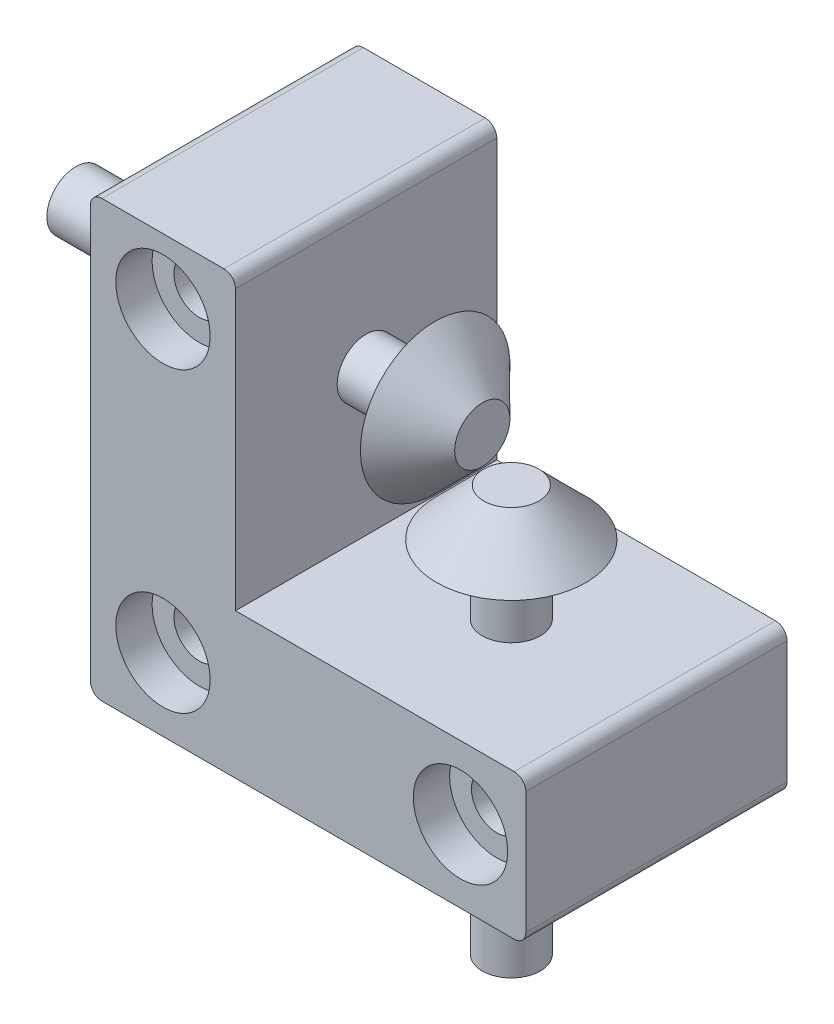
ISO-10303-21;
HEADER;
FILE_DESCRIPTION(('STEP AP214'),'2;1');
FILE_NAME('part.step','',(''),(''),'','','');
FILE_SCHEMA(('AUTOMOTIVE_DESIGN { 1 0 10303 214 1 1 1 1 }'));
ENDSEC;
DATA;
#1=APPLICATION_CONTEXT('core data for automotive mechanical design processes');
#2=APPLICATION_PROTOCOL_DEFINITION('international standard','automotive_design',2000,#1);
#3=PRODUCT_CONTEXT('',#1,'mechanical');
#4=PRODUCT('Part','Part','',(#3));
#5=PRODUCT_RELATED_PRODUCT_CATEGORY('part','',(#4));
#6=PRODUCT_DEFINITION_FORMATION('','',#4);
#7=PRODUCT_DEFINITION_CONTEXT('part definition',#1,'design');
#8=PRODUCT_DEFINITION('design','',#6,#7);
#9=PRODUCT_DEFINITION_SHAPE('','',#8);
#10=(LENGTH_UNIT() NAMED_UNIT(*) SI_UNIT(.MILLI.,.METRE.));
#11=(NAMED_UNIT(*) PLANE_ANGLE_UNIT() SI_UNIT($,.RADIAN.));
#12=(NAMED_UNIT(*) SI_UNIT($,.STERADIAN.) SOLID_ANGLE_UNIT());
#13=UNCERTAINTY_MEASURE_WITH_UNIT(LENGTH_MEASURE(1.E-05),#10,'distance_accuracy_value','');
#14=(GEOMETRIC_REPRESENTATION_CONTEXT(3) GLOBAL_UNCERTAINTY_ASSIGNED_CONTEXT((#13)) GLOBAL_UNIT_ASSIGNED_CONTEXT((#10,
#11,#12)) REPRESENTATION_CONTEXT('',''));
#15=CARTESIAN_POINT('',(0.,0.,0.));
#16=DIRECTION('',(0.,0.,1.));
#17=DIRECTION('',(1.,0.,0.));
#18=AXIS2_PLACEMENT_3D('',#15,#16,#17);
#19=CARTESIAN_POINT('',(5.,25.5,22.9497474683058));
#20=DIRECTION('',(0.,0.,-1.));
#21=DIRECTION('',(-1.,0.,0.));
#22=AXIS2_PLACEMENT_3D('',#19,#20,#21);
#23=CYLINDRICAL_SURFACE('',#22,1.75);
#24=CARTESIAN_POINT('',(5.,25.5,2.5));
#25=DIRECTION('',(0.,0.,-1.));
#26=DIRECTION('',(-1.,0.,0.));
#27=AXIS2_PLACEMENT_3D('',#24,#25,#26);
#28=CIRCLE('',#27,1.75);
#29=CARTESIAN_POINT('',(3.25,25.5,2.5));
#30=VERTEX_POINT('',#29);
#31=EDGE_CURVE('E159',#30,#30,#28,.F.);
#32=ORIENTED_EDGE('',*,*,#31,.F.);
#33=EDGE_LOOP('',(#32));
#34=FACE_BOUND('',#33,.T.);
#35=CARTESIAN_POINT('',(5.,25.5,15.5));
#36=DIRECTION('',(0.,0.,1.));
#37=DIRECTION('',(1.,0.,0.));
#38=AXIS2_PLACEMENT_3D('',#35,#36,#37);
#39=CIRCLE('',#38,1.75);
#40=CARTESIAN_POINT('',(6.75,25.5,15.5));
#41=VERTEX_POINT('',#40);
#42=EDGE_CURVE('E188',#41,#41,#39,.F.);
#43=ORIENTED_EDGE('',*,*,#42,.F.);
#44=EDGE_LOOP('',(#43));
#45=FACE_BOUND('',#44,.T.);
#46=ADVANCED_FACE('F36',(#34,#45),#23,.F.);
#47=CARTESIAN_POINT('',(5.,5.,22.9497474683058));
#48=DIRECTION('',(0.,0.,-1.));
#49=DIRECTION('',(-1.,0.,0.));
#50=AXIS2_PLACEMENT_3D('',#47,#48,#49);
#51=CYLINDRICAL_SURFACE('',#50,1.75);
#52=CARTESIAN_POINT('',(5.,5.,2.5));
#53=DIRECTION('',(0.,0.,-1.));
#54=DIRECTION('',(-1.,0.,0.));
#55=AXIS2_PLACEMENT_3D('',#52,#53,#54);
#56=CIRCLE('',#55,1.75);
#57=CARTESIAN_POINT('',(3.25,5.,2.5));
#58=VERTEX_POINT('',#57);
#59=EDGE_CURVE('E175',#58,#58,#56,.F.);
#60=ORIENTED_EDGE('',*,*,#59,.F.);
#61=EDGE_LOOP('',(#60));
#62=FACE_BOUND('',#61,.T.);
#63=CARTESIAN_POINT('',(5.,5.,15.5));
#64=DIRECTION('',(0.,0.,1.));
#65=DIRECTION('',(1.,0.,0.));
#66=AXIS2_PLACEMENT_3D('',#63,#64,#65);
#67=CIRCLE('',#66,1.75);
#68=CARTESIAN_POINT('',(6.75,5.,15.5));
#69=VERTEX_POINT('',#68);
#70=EDGE_CURVE('E184',#69,#69,#67,.F.);
#71=ORIENTED_EDGE('',*,*,#70,.F.);
#72=EDGE_LOOP('',(#71));
#73=FACE_BOUND('',#72,.T.);
#74=ADVANCED_FACE('F255',(#62,#73),#51,.F.);
#75=CARTESIAN_POINT('',(25.5,5.,22.9497474683058));
#76=DIRECTION('',(0.,0.,-1.));
#77=DIRECTION('',(-1.,0.,0.));
#78=AXIS2_PLACEMENT_3D('',#75,#76,#77);
#79=CYLINDRICAL_SURFACE('',#78,1.75);
#80=CARTESIAN_POINT('',(25.5,5.,2.5));
#81=DIRECTION('',(0.,0.,-1.));
#82=DIRECTION('',(-1.,0.,0.));
#83=AXIS2_PLACEMENT_3D('',#80,#81,#82);
#84=CIRCLE('',#83,1.75);
#85=CARTESIAN_POINT('',(23.75,5.,2.5));
#86=VERTEX_POINT('',#85);
#87=EDGE_CURVE('E172',#86,#86,#84,.F.);
#88=ORIENTED_EDGE('',*,*,#87,.F.);
#89=EDGE_LOOP('',(#88));
#90=FACE_BOUND('',#89,.T.);
#91=CARTESIAN_POINT('',(25.5,5.,15.5));
#92=DIRECTION('',(0.,0.,1.));
#93=DIRECTION('',(1.,0.,0.));
#94=AXIS2_PLACEMENT_3D('',#91,#92,#93);
#95=CIRCLE('',#94,1.75);
#96=CARTESIAN_POINT('',(27.25,5.,15.5));
#97=VERTEX_POINT('',#96);
#98=EDGE_CURVE('E181',#97,#97,#95,.F.);
#99=ORIENTED_EDGE('',*,*,#98,.F.);
#100=EDGE_LOOP('',(#99));
#101=FACE_BOUND('',#100,.T.);
#102=ADVANCED_FACE('F261',(#90,#101),#79,.F.);
#103=CARTESIAN_POINT('',(10.,30.,18.));
#104=DIRECTION('',(1.,0.,0.));
#105=DIRECTION('',(0.,1.,0.));
#106=AXIS2_PLACEMENT_3D('',#103,#104,#105);
#107=PLANE('',#106);
#108=CARTESIAN_POINT('',(10.,19.9999999999999,9.));
#109=DIRECTION('',(1.,0.,0.));
#110=DIRECTION('',(0.,1.,0.));
#111=AXIS2_PLACEMENT_3D('',#108,#109,#110);
#112=CIRCLE('',#111,2.);
#113=CARTESIAN_POINT('',(10.,21.9999999999999,9.));
#114=VERTEX_POINT('',#113);
#115=EDGE_CURVE('E11',#114,#114,#112,.T.);
#116=ORIENTED_EDGE('',*,*,#115,.F.);
#117=EDGE_LOOP('',(#116));
#118=FACE_BOUND('',#117,.T.);
#119=DIRECTION('',(0.,-1.,0.));
#120=VECTOR('',#119,1.);
#121=CARTESIAN_POINT('',(10.,30.,0.));
#122=LINE('',#121,#120);
#123=CARTESIAN_POINT('',(10.,29.2,0.));
#124=VERTEX_POINT('',#123);
#125=CARTESIAN_POINT('',(10.,10.,0.));
#126=VERTEX_POINT('',#125);
#127=EDGE_CURVE('E157',#124,#126,#122,.T.);
#128=ORIENTED_EDGE('',*,*,#127,.F.);
#129=DIRECTION('',(0.,0.,-1.));
#130=VECTOR('',#129,1.);
#131=CARTESIAN_POINT('',(10.,29.2,18.));
#132=LINE('',#131,#130);
#133=CARTESIAN_POINT('',(10.,29.2,18.));
#134=VERTEX_POINT('',#133);
#135=EDGE_CURVE('E128',#124,#134,#132,.F.);
#136=ORIENTED_EDGE('',*,*,#135,.T.);
#137=DIRECTION('',(0.,-1.,0.));
#138=VECTOR('',#137,1.);
#139=CARTESIAN_POINT('',(10.,30.,18.));
#140=LINE('',#139,#138);
#141=CARTESIAN_POINT('',(10.,10.,18.));
#142=VERTEX_POINT('',#141);
#143=EDGE_CURVE('E121',#134,#142,#140,.T.);
#144=ORIENTED_EDGE('',*,*,#143,.T.);
#145=DIRECTION('',(0.,0.,-1.));
#146=VECTOR('',#145,1.);
#147=CARTESIAN_POINT('',(10.,10.,18.));
#148=LINE('',#147,#146);
#149=EDGE_CURVE('E125',#142,#126,#148,.T.);
#150=ORIENTED_EDGE('',*,*,#149,.T.);
#151=EDGE_LOOP('',(#128,#136,#144,#150));
#152=FACE_BOUND('',#151,.T.);
#153=ADVANCED_FACE('F124',(#118,#152),#107,.T.);
#154=CARTESIAN_POINT('',(0.,30.,18.));
#155=DIRECTION('',(0.,1.,0.));
#156=DIRECTION('',(-1.,0.,0.));
#157=AXIS2_PLACEMENT_3D('',#154,#155,#156);
#158=PLANE('',#157);
#159=DIRECTION('',(1.,0.,0.));
#160=VECTOR('',#159,1.);
#161=CARTESIAN_POINT('',(0.,30.,0.));
#162=LINE('',#161,#160);
#163=CARTESIAN_POINT('',(0.8,30.,0.));
#164=VERTEX_POINT('',#163);
#165=CARTESIAN_POINT('',(9.2,30.,0.));
#166=VERTEX_POINT('',#165);
#167=EDGE_CURVE('E131',#164,#166,#162,.T.);
#168=ORIENTED_EDGE('',*,*,#167,.F.);
#169=DIRECTION('',(0.,0.,-1.));
#170=VECTOR('',#169,1.);
#171=CARTESIAN_POINT('',(0.8,30.,18.));
#172=LINE('',#171,#170);
#173=CARTESIAN_POINT('',(0.8,30.,18.));
#174=VERTEX_POINT('',#173);
#175=EDGE_CURVE('E227',#164,#174,#172,.F.);
#176=ORIENTED_EDGE('',*,*,#175,.T.);
#177=DIRECTION('',(1.,0.,0.));
#178=VECTOR('',#177,1.);
#179=CARTESIAN_POINT('',(0.,30.,18.));
#180=LINE('',#179,#178);
#181=CARTESIAN_POINT('',(9.2,30.,18.));
#182=VERTEX_POINT('',#181);
#183=EDGE_CURVE('E140',#174,#182,#180,.T.);
#184=ORIENTED_EDGE('',*,*,#183,.T.);
#185=DIRECTION('',(0.,0.,-1.));
#186=VECTOR('',#185,1.);
#187=CARTESIAN_POINT('',(9.2,30.,18.));
#188=LINE('',#187,#186);
#189=EDGE_CURVE('E224',#182,#166,#188,.T.);
#190=ORIENTED_EDGE('',*,*,#189,.T.);
#191=EDGE_LOOP('',(#168,#176,#184,#190));
#192=FACE_BOUND('',#191,.T.);
#193=ADVANCED_FACE('F272',(#192),#158,.T.);
#194=CARTESIAN_POINT('',(0.,0.,18.));
#195=DIRECTION('',(-1.,0.,0.));
#196=DIRECTION('',(0.,0.,1.));
#197=AXIS2_PLACEMENT_3D('',#194,#195,#196);
#198=PLANE('',#197);
#199=CARTESIAN_POINT('',(0.,20.,9.));
#200=DIRECTION('',(-1.,0.,0.));
#201=DIRECTION('',(0.,0.,1.));
#202=AXIS2_PLACEMENT_3D('',#199,#200,#201);
#203=CIRCLE('',#202,2.);
#204=CARTESIAN_POINT('',(0.,20.,11.));
#205=VERTEX_POINT('',#204);
#206=EDGE_CURVE('E232',#205,#205,#203,.T.);
#207=ORIENTED_EDGE('',*,*,#206,.F.);
#208=EDGE_LOOP('',(#207));
#209=FACE_BOUND('',#208,.T.);
#210=DIRECTION('',(0.,1.,0.));
#211=VECTOR('',#210,1.);
#212=CARTESIAN_POINT('',(0.,0.,0.));
#213=LINE('',#212,#211);
#214=CARTESIAN_POINT('',(0.,0.8,0.));
#215=VERTEX_POINT('',#214);
#216=CARTESIAN_POINT('',(0.,29.2,0.));
#217=VERTEX_POINT('',#216);
#218=EDGE_CURVE('E167',#215,#217,#213,.T.);
#219=ORIENTED_EDGE('',*,*,#218,.F.);
#220=DIRECTION('',(0.,0.,-1.));
#221=VECTOR('',#220,1.);
#222=CARTESIAN_POINT('',(0.,0.8,18.));
#223=LINE('',#222,#221);
#224=CARTESIAN_POINT('',(0.,0.8,18.));
#225=VERTEX_POINT('',#224);
#226=EDGE_CURVE('E209',#215,#225,#223,.F.);
#227=ORIENTED_EDGE('',*,*,#226,.T.);
#228=DIRECTION('',(0.,1.,0.));
#229=VECTOR('',#228,1.);
#230=CARTESIAN_POINT('',(0.,0.,18.));
#231=LINE('',#230,#229);
#232=CARTESIAN_POINT('',(0.,29.2,18.));
#233=VERTEX_POINT('',#232);
#234=EDGE_CURVE('E152',#225,#233,#231,.T.);
#235=ORIENTED_EDGE('',*,*,#234,.T.);
#236=DIRECTION('',(0.,0.,-1.));
#237=VECTOR('',#236,1.);
#238=CARTESIAN_POINT('',(0.,29.2,18.));
#239=LINE('',#238,#237);
#240=EDGE_CURVE('E206',#233,#217,#239,.T.);
#241=ORIENTED_EDGE('',*,*,#240,.T.);
#242=EDGE_LOOP('',(#219,#227,#235,#241));
#243=FACE_BOUND('',#242,.T.);
#244=ADVANCED_FACE('F275',(#209,#243),#198,.T.);
#245=CARTESIAN_POINT('',(30.,0.,18.));
#246=DIRECTION('',(0.,-1.,0.));
#247=DIRECTION('',(0.,0.,-1.));
#248=AXIS2_PLACEMENT_3D('',#245,#246,#247);
#249=PLANE('',#248);
#250=CARTESIAN_POINT('',(20.,0.,9.));
#251=DIRECTION('',(0.,-1.,0.));
#252=DIRECTION('',(0.,0.,-1.));
#253=AXIS2_PLACEMENT_3D('',#250,#251,#252);
#254=CIRCLE('',#253,2.);
#255=CARTESIAN_POINT('',(20.,0.,7.));
#256=VERTEX_POINT('',#255);
#257=EDGE_CURVE('E287',#256,#256,#254,.T.);
#258=ORIENTED_EDGE('',*,*,#257,.F.);
#259=EDGE_LOOP('',(#258));
#260=FACE_BOUND('',#259,.T.);
#261=DIRECTION('',(-1.,0.,0.));
#262=VECTOR('',#261,1.);
#263=CARTESIAN_POINT('',(30.,0.,18.));
#264=LINE('',#263,#262);
#265=CARTESIAN_POINT('',(29.2,0.,18.));
#266=VERTEX_POINT('',#265);
#267=CARTESIAN_POINT('',(0.799999999999999,0.,18.));
#268=VERTEX_POINT('',#267);
#269=EDGE_CURVE('E146',#266,#268,#264,.T.);
#270=ORIENTED_EDGE('',*,*,#269,.T.);
#271=DIRECTION('',(0.,0.,-1.));
#272=VECTOR('',#271,1.);
#273=CARTESIAN_POINT('',(0.799999999999999,0.,18.));
#274=LINE('',#273,#272);
#275=CARTESIAN_POINT('',(0.799999999999999,0.,0.));
#276=VERTEX_POINT('',#275);
#277=EDGE_CURVE('E193',#268,#276,#274,.T.);
#278=ORIENTED_EDGE('',*,*,#277,.T.);
#279=DIRECTION('',(-1.,0.,0.));
#280=VECTOR('',#279,1.);
#281=CARTESIAN_POINT('',(30.,0.,0.));
#282=LINE('',#281,#280);
#283=CARTESIAN_POINT('',(29.2,0.,0.));
#284=VERTEX_POINT('',#283);
#285=EDGE_CURVE('E164',#284,#276,#282,.T.);
#286=ORIENTED_EDGE('',*,*,#285,.F.);
#287=DIRECTION('',(0.,0.,-1.));
#288=VECTOR('',#287,1.);
#289=CARTESIAN_POINT('',(29.2,0.,18.));
#290=LINE('',#289,#288);
#291=EDGE_CURVE('E139',#284,#266,#290,.F.);
#292=ORIENTED_EDGE('',*,*,#291,.T.);
#293=EDGE_LOOP('',(#270,#278,#286,#292));
#294=FACE_BOUND('',#293,.T.);
#295=ADVANCED_FACE('F250',(#260,#294),#249,.T.);
#296=CARTESIAN_POINT('',(30.,10.,18.));
#297=DIRECTION('',(1.,0.,0.));
#298=DIRECTION('',(0.,0.,-1.));
#299=AXIS2_PLACEMENT_3D('',#296,#297,#298);
#300=PLANE('',#299);
#301=DIRECTION('',(0.,-1.,0.));
#302=VECTOR('',#301,1.);
#303=CARTESIAN_POINT('',(30.,10.,18.));
#304=LINE('',#303,#302);
#305=CARTESIAN_POINT('',(30.,9.2,18.));
#306=VERTEX_POINT('',#305);
#307=CARTESIAN_POINT('',(30.,0.8,18.));
#308=VERTEX_POINT('',#307);
#309=EDGE_CURVE('E144',#306,#308,#304,.T.);
#310=ORIENTED_EDGE('',*,*,#309,.T.);
#311=DIRECTION('',(0.,0.,-1.));
#312=VECTOR('',#311,1.);
#313=CARTESIAN_POINT('',(30.,0.8,18.));
#314=LINE('',#313,#312);
#315=CARTESIAN_POINT('',(30.,0.8,0.));
#316=VERTEX_POINT('',#315);
#317=EDGE_CURVE('E221',#308,#316,#314,.T.);
#318=ORIENTED_EDGE('',*,*,#317,.T.);
#319=DIRECTION('',(0.,-1.,0.));
#320=VECTOR('',#319,1.);
#321=CARTESIAN_POINT('',(30.,10.,0.));
#322=LINE('',#321,#320);
#323=CARTESIAN_POINT('',(30.,9.2,0.));
#324=VERTEX_POINT('',#323);
#325=EDGE_CURVE('E161',#324,#316,#322,.T.);
#326=ORIENTED_EDGE('',*,*,#325,.F.);
#327=DIRECTION('',(0.,0.,-1.));
#328=VECTOR('',#327,1.);
#329=CARTESIAN_POINT('',(30.,9.2,18.));
#330=LINE('',#329,#328);
#331=EDGE_CURVE('E219',#324,#306,#330,.F.);
#332=ORIENTED_EDGE('',*,*,#331,.T.);
#333=EDGE_LOOP('',(#310,#318,#326,#332));
#334=FACE_BOUND('',#333,.T.);
#335=ADVANCED_FACE('F241',(#334),#300,.T.);
#336=CARTESIAN_POINT('',(10.,10.,18.));
#337=DIRECTION('',(0.,1.,0.));
#338=DIRECTION('',(0.,0.,1.));
#339=AXIS2_PLACEMENT_3D('',#336,#337,#338);
#340=PLANE('',#339);
#341=CARTESIAN_POINT('',(20.,10.,9.));
#342=DIRECTION('',(0.,1.,0.));
#343=DIRECTION('',(0.,0.,1.));
#344=AXIS2_PLACEMENT_3D('',#341,#342,#343);
#345=CIRCLE('',#344,2.);
#346=CARTESIAN_POINT('',(20.,10.,11.));
#347=VERTEX_POINT('',#346);
#348=EDGE_CURVE('E44',#347,#347,#345,.T.);
#349=ORIENTED_EDGE('',*,*,#348,.F.);
#350=EDGE_LOOP('',(#349));
#351=FACE_BOUND('',#350,.T.);
#352=DIRECTION('',(1.,0.,0.));
#353=VECTOR('',#352,1.);
#354=CARTESIAN_POINT('',(10.,10.,18.));
#355=LINE('',#354,#353);
#356=CARTESIAN_POINT('',(29.2,10.,18.));
#357=VERTEX_POINT('',#356);
#358=EDGE_CURVE('E130',#142,#357,#355,.T.);
#359=ORIENTED_EDGE('',*,*,#358,.T.);
#360=DIRECTION('',(0.,0.,-1.));
#361=VECTOR('',#360,1.);
#362=CARTESIAN_POINT('',(29.2,10.,18.));
#363=LINE('',#362,#361);
#364=CARTESIAN_POINT('',(29.2,10.,0.));
#365=VERTEX_POINT('',#364);
#366=EDGE_CURVE('E230',#357,#365,#363,.T.);
#367=ORIENTED_EDGE('',*,*,#366,.T.);
#368=DIRECTION('',(1.,0.,0.));
#369=VECTOR('',#368,1.);
#370=CARTESIAN_POINT('',(10.,10.,0.));
#371=LINE('',#370,#369);
#372=EDGE_CURVE('E138',#126,#365,#371,.T.);
#373=ORIENTED_EDGE('',*,*,#372,.F.);
#374=ORIENTED_EDGE('',*,*,#149,.F.);
#375=EDGE_LOOP('',(#359,#367,#373,#374));
#376=FACE_BOUND('',#375,.T.);
#377=ADVANCED_FACE('F134',(#351,#376),#340,.T.);
#378=CARTESIAN_POINT('',(0.,0.,18.));
#379=DIRECTION('',(0.,0.,1.));
#380=DIRECTION('',(1.,0.,0.));
#381=AXIS2_PLACEMENT_3D('',#378,#379,#380);
#382=PLANE('',#381);
#383=CARTESIAN_POINT('',(25.5,5.,18.));
#384=DIRECTION('',(0.,0.,-1.));
#385=DIRECTION('',(-1.,0.,0.));
#386=AXIS2_PLACEMENT_3D('',#383,#384,#385);
#387=CIRCLE('',#386,3.25);
#388=CARTESIAN_POINT('',(22.25,5.,18.));
#389=VERTEX_POINT('',#388);
#390=EDGE_CURVE('E376',#389,#389,#387,.T.);
#391=ORIENTED_EDGE('',*,*,#390,.T.);
#392=EDGE_LOOP('',(#391));
#393=FACE_BOUND('',#392,.T.);
#394=CARTESIAN_POINT('',(5.,5.,18.));
#395=DIRECTION('',(0.,0.,-1.));
#396=DIRECTION('',(-1.,0.,0.));
#397=AXIS2_PLACEMENT_3D('',#394,#395,#396);
#398=CIRCLE('',#397,3.25);
#399=CARTESIAN_POINT('',(1.75,5.,18.));
#400=VERTEX_POINT('',#399);
#401=EDGE_CURVE('E382',#400,#400,#398,.T.);
#402=ORIENTED_EDGE('',*,*,#401,.T.);
#403=EDGE_LOOP('',(#402));
#404=FACE_BOUND('',#403,.T.);
#405=CARTESIAN_POINT('',(5.,25.5,18.));
#406=DIRECTION('',(0.,0.,-1.));
#407=DIRECTION('',(-1.,0.,0.));
#408=AXIS2_PLACEMENT_3D('',#405,#406,#407);
#409=CIRCLE('',#408,3.25);
#410=CARTESIAN_POINT('',(1.75,25.5,18.));
#411=VERTEX_POINT('',#410);
#412=EDGE_CURVE('E372',#411,#411,#409,.T.);
#413=ORIENTED_EDGE('',*,*,#412,.T.);
#414=EDGE_LOOP('',(#413));
#415=FACE_BOUND('',#414,.T.);
#416=ORIENTED_EDGE('',*,*,#234,.F.);
#417=CARTESIAN_POINT('',(0.799999999999999,0.8,18.));
#418=DIRECTION('',(0.,0.,1.));
#419=DIRECTION('',(1.,0.,0.));
#420=AXIS2_PLACEMENT_3D('',#417,#418,#419);
#421=CIRCLE('',#420,0.8);
#422=EDGE_CURVE('E217',#225,#268,#421,.T.);
#423=ORIENTED_EDGE('',*,*,#422,.T.);
#424=ORIENTED_EDGE('',*,*,#269,.F.);
#425=CARTESIAN_POINT('',(29.2,0.8,18.));
#426=DIRECTION('',(0.,0.,1.));
#427=DIRECTION('',(1.,0.,0.));
#428=AXIS2_PLACEMENT_3D('',#425,#426,#427);
#429=CIRCLE('',#428,0.8);
#430=EDGE_CURVE('E57',#266,#308,#429,.T.);
#431=ORIENTED_EDGE('',*,*,#430,.T.);
#432=ORIENTED_EDGE('',*,*,#309,.F.);
#433=CARTESIAN_POINT('',(29.2,9.2,18.));
#434=DIRECTION('',(0.,0.,1.));
#435=DIRECTION('',(1.,0.,0.));
#436=AXIS2_PLACEMENT_3D('',#433,#434,#435);
#437=CIRCLE('',#436,0.8);
#438=EDGE_CURVE('E51',#306,#357,#437,.T.);
#439=ORIENTED_EDGE('',*,*,#438,.T.);
#440=ORIENTED_EDGE('',*,*,#358,.F.);
#441=ORIENTED_EDGE('',*,*,#143,.F.);
#442=CARTESIAN_POINT('',(9.2,29.2,18.));
#443=DIRECTION('',(0.,0.,1.));
#444=DIRECTION('',(1.,0.,0.));
#445=AXIS2_PLACEMENT_3D('',#442,#443,#444);
#446=CIRCLE('',#445,0.8);
#447=EDGE_CURVE('E212',#134,#182,#446,.T.);
#448=ORIENTED_EDGE('',*,*,#447,.T.);
#449=ORIENTED_EDGE('',*,*,#183,.F.);
#450=CARTESIAN_POINT('',(0.8,29.2,18.));
#451=DIRECTION('',(0.,0.,1.));
#452=DIRECTION('',(1.,0.,0.));
#453=AXIS2_PLACEMENT_3D('',#450,#451,#452);
#454=CIRCLE('',#453,0.8);
#455=EDGE_CURVE('E214',#174,#233,#454,.T.);
#456=ORIENTED_EDGE('',*,*,#455,.T.);
#457=EDGE_LOOP('',(#416,#423,#424,#431,#432,#439,#440,#441,#448,#449,#456));
#458=FACE_BOUND('',#457,.T.);
#459=ADVANCED_FACE('F143',(#393,#404,#415,#458),#382,.T.);
#460=CARTESIAN_POINT('',(0.,0.,0.));
#461=DIRECTION('',(0.,0.,1.));
#462=DIRECTION('',(1.,0.,0.));
#463=AXIS2_PLACEMENT_3D('',#460,#461,#462);
#464=PLANE('',#463);
#465=CARTESIAN_POINT('',(25.5,5.,0.));
#466=DIRECTION('',(0.,0.,-1.));
#467=DIRECTION('',(-1.,0.,0.));
#468=AXIS2_PLACEMENT_3D('',#465,#466,#467);
#469=CIRCLE('',#468,3.25);
#470=CARTESIAN_POINT('',(22.25,5.,0.));
#471=VERTEX_POINT('',#470);
#472=EDGE_CURVE('E392',#471,#471,#469,.T.);
#473=ORIENTED_EDGE('',*,*,#472,.F.);
#474=EDGE_LOOP('',(#473));
#475=FACE_BOUND('',#474,.T.);
#476=CARTESIAN_POINT('',(5.,5.,0.));
#477=DIRECTION('',(0.,0.,-1.));
#478=DIRECTION('',(-1.,0.,0.));
#479=AXIS2_PLACEMENT_3D('',#476,#477,#478);
#480=CIRCLE('',#479,3.25);
#481=CARTESIAN_POINT('',(1.75,5.,0.));
#482=VERTEX_POINT('',#481);
#483=EDGE_CURVE('E398',#482,#482,#480,.T.);
#484=ORIENTED_EDGE('',*,*,#483,.F.);
#485=EDGE_LOOP('',(#484));
#486=FACE_BOUND('',#485,.T.);
#487=CARTESIAN_POINT('',(5.,25.5,0.));
#488=DIRECTION('',(0.,0.,-1.));
#489=DIRECTION('',(-1.,0.,0.));
#490=AXIS2_PLACEMENT_3D('',#487,#488,#489);
#491=CIRCLE('',#490,3.25);
#492=CARTESIAN_POINT('',(1.75,25.5,0.));
#493=VERTEX_POINT('',#492);
#494=EDGE_CURVE('E191',#493,#493,#491,.T.);
#495=ORIENTED_EDGE('',*,*,#494,.F.);
#496=EDGE_LOOP('',(#495));
#497=FACE_BOUND('',#496,.T.);
#498=ORIENTED_EDGE('',*,*,#285,.T.);
#499=CARTESIAN_POINT('',(0.799999999999999,0.8,0.));
#500=DIRECTION('',(0.,0.,1.));
#501=DIRECTION('',(1.,0.,0.));
#502=AXIS2_PLACEMENT_3D('',#499,#500,#501);
#503=CIRCLE('',#502,0.8);
#504=EDGE_CURVE('E204',#276,#215,#503,.F.);
#505=ORIENTED_EDGE('',*,*,#504,.T.);
#506=ORIENTED_EDGE('',*,*,#218,.T.);
#507=CARTESIAN_POINT('',(0.8,29.2,0.));
#508=DIRECTION('',(0.,0.,1.));
#509=DIRECTION('',(1.,0.,0.));
#510=AXIS2_PLACEMENT_3D('',#507,#508,#509);
#511=CIRCLE('',#510,0.8);
#512=EDGE_CURVE('E200',#217,#164,#511,.F.);
#513=ORIENTED_EDGE('',*,*,#512,.T.);
#514=ORIENTED_EDGE('',*,*,#167,.T.);
#515=CARTESIAN_POINT('',(9.2,29.2,0.));
#516=DIRECTION('',(0.,0.,1.));
#517=DIRECTION('',(1.,0.,0.));
#518=AXIS2_PLACEMENT_3D('',#515,#516,#517);
#519=CIRCLE('',#518,0.8);
#520=EDGE_CURVE('E198',#166,#124,#519,.F.);
#521=ORIENTED_EDGE('',*,*,#520,.T.);
#522=ORIENTED_EDGE('',*,*,#127,.T.);
#523=ORIENTED_EDGE('',*,*,#372,.T.);
#524=CARTESIAN_POINT('',(29.2,9.2,0.));
#525=DIRECTION('',(0.,0.,1.));
#526=DIRECTION('',(1.,0.,0.));
#527=AXIS2_PLACEMENT_3D('',#524,#525,#526);
#528=CIRCLE('',#527,0.8);
#529=EDGE_CURVE('E196',#365,#324,#528,.F.);
#530=ORIENTED_EDGE('',*,*,#529,.T.);
#531=ORIENTED_EDGE('',*,*,#325,.T.);
#532=CARTESIAN_POINT('',(29.2,0.8,0.));
#533=DIRECTION('',(0.,0.,1.));
#534=DIRECTION('',(1.,0.,0.));
#535=AXIS2_PLACEMENT_3D('',#532,#533,#534);
#536=CIRCLE('',#535,0.8);
#537=EDGE_CURVE('E202',#316,#284,#536,.F.);
#538=ORIENTED_EDGE('',*,*,#537,.T.);
#539=EDGE_LOOP('',(#498,#505,#506,#513,#514,#521,#522,#523,#530,#531,#538));
#540=FACE_BOUND('',#539,.T.);
#541=ADVANCED_FACE('F247',(#475,#486,#497,#540),#464,.F.);
#542=CARTESIAN_POINT('',(25.5,5.,2.5));
#543=DIRECTION('',(0.,0.,-1.));
#544=DIRECTION('',(-1.,0.,0.));
#545=AXIS2_PLACEMENT_3D('',#542,#543,#544);
#546=PLANE('',#545);
#547=CARTESIAN_POINT('',(25.5,5.,2.5));
#548=DIRECTION('',(0.,0.,-1.));
#549=DIRECTION('',(-1.,0.,0.));
#550=AXIS2_PLACEMENT_3D('',#547,#548,#549);
#551=CIRCLE('',#550,3.25);
#552=CARTESIAN_POINT('',(22.25,5.,2.5));
#553=VERTEX_POINT('',#552);
#554=EDGE_CURVE('E176',#553,#553,#551,.T.);
#555=ORIENTED_EDGE('',*,*,#554,.T.);
#556=EDGE_LOOP('',(#555));
#557=FACE_BOUND('',#556,.T.);
#558=ORIENTED_EDGE('',*,*,#87,.T.);
#559=EDGE_LOOP('',(#558));
#560=FACE_BOUND('',#559,.T.);
#561=ADVANCED_FACE('F270',(#557,#560),#546,.T.);
#562=CARTESIAN_POINT('',(25.5,5.,2.5));
#563=DIRECTION('',(0.,0.,-1.));
#564=DIRECTION('',(-1.,0.,0.));
#565=AXIS2_PLACEMENT_3D('',#562,#563,#564);
#566=CYLINDRICAL_SURFACE('',#565,3.25);
#567=ORIENTED_EDGE('',*,*,#554,.F.);
#568=EDGE_LOOP('',(#567));
#569=FACE_BOUND('',#568,.T.);
#570=ORIENTED_EDGE('',*,*,#472,.T.);
#571=EDGE_LOOP('',(#570));
#572=FACE_BOUND('',#571,.T.);
#573=ADVANCED_FACE('F431',(#569,#572),#566,.F.);
#574=CARTESIAN_POINT('',(5.,5.,2.5));
#575=DIRECTION('',(0.,0.,-1.));
#576=DIRECTION('',(-1.,0.,0.));
#577=AXIS2_PLACEMENT_3D('',#574,#575,#576);
#578=PLANE('',#577);
#579=CARTESIAN_POINT('',(5.,5.,2.5));
#580=DIRECTION('',(0.,0.,-1.));
#581=DIRECTION('',(-1.,0.,0.));
#582=AXIS2_PLACEMENT_3D('',#579,#580,#581);
#583=CIRCLE('',#582,3.25);
#584=CARTESIAN_POINT('',(1.75,5.,2.5));
#585=VERTEX_POINT('',#584);
#586=EDGE_CURVE('E395',#585,#585,#583,.T.);
#587=ORIENTED_EDGE('',*,*,#586,.T.);
#588=EDGE_LOOP('',(#587));
#589=FACE_BOUND('',#588,.T.);
#590=ORIENTED_EDGE('',*,*,#59,.T.);
#591=EDGE_LOOP('',(#590));
#592=FACE_BOUND('',#591,.T.);
#593=ADVANCED_FACE('F427',(#589,#592),#578,.T.);
#594=CARTESIAN_POINT('',(5.,5.,2.5));
#595=DIRECTION('',(0.,0.,-1.));
#596=DIRECTION('',(-1.,0.,0.));
#597=AXIS2_PLACEMENT_3D('',#594,#595,#596);
#598=CYLINDRICAL_SURFACE('',#597,3.25);
#599=ORIENTED_EDGE('',*,*,#586,.F.);
#600=EDGE_LOOP('',(#599));
#601=FACE_BOUND('',#600,.T.);
#602=ORIENTED_EDGE('',*,*,#483,.T.);
#603=EDGE_LOOP('',(#602));
#604=FACE_BOUND('',#603,.T.);
#605=ADVANCED_FACE('F420',(#601,#604),#598,.F.);
#606=CARTESIAN_POINT('',(5.,25.5,2.5));
#607=DIRECTION('',(0.,0.,-1.));
#608=DIRECTION('',(-1.,0.,0.));
#609=AXIS2_PLACEMENT_3D('',#606,#607,#608);
#610=PLANE('',#609);
#611=CARTESIAN_POINT('',(5.,25.5,2.5));
#612=DIRECTION('',(0.,0.,-1.));
#613=DIRECTION('',(-1.,0.,0.));
#614=AXIS2_PLACEMENT_3D('',#611,#612,#613);
#615=CIRCLE('',#614,3.25);
#616=CARTESIAN_POINT('',(1.75,25.5,2.5));
#617=VERTEX_POINT('',#616);
#618=EDGE_CURVE('E401',#617,#617,#615,.T.);
#619=ORIENTED_EDGE('',*,*,#618,.T.);
#620=EDGE_LOOP('',(#619));
#621=FACE_BOUND('',#620,.T.);
#622=ORIENTED_EDGE('',*,*,#31,.T.);
#623=EDGE_LOOP('',(#622));
#624=FACE_BOUND('',#623,.T.);
#625=ADVANCED_FACE('F410',(#621,#624),#610,.T.);
#626=CARTESIAN_POINT('',(5.,25.5,2.5));
#627=DIRECTION('',(0.,0.,-1.));
#628=DIRECTION('',(-1.,0.,0.));
#629=AXIS2_PLACEMENT_3D('',#626,#627,#628);
#630=CYLINDRICAL_SURFACE('',#629,3.25);
#631=ORIENTED_EDGE('',*,*,#618,.F.);
#632=EDGE_LOOP('',(#631));
#633=FACE_BOUND('',#632,.T.);
#634=ORIENTED_EDGE('',*,*,#494,.T.);
#635=EDGE_LOOP('',(#634));
#636=FACE_BOUND('',#635,.T.);
#637=ADVANCED_FACE('F406',(#633,#636),#630,.F.);
#638=CARTESIAN_POINT('',(5.,25.5,15.5));
#639=DIRECTION('',(0.,0.,1.));
#640=DIRECTION('',(-1.,0.,0.));
#641=AXIS2_PLACEMENT_3D('',#638,#639,#640);
#642=PLANE('',#641);
#643=CARTESIAN_POINT('',(5.,25.5,15.5));
#644=DIRECTION('',(0.,0.,-1.));
#645=DIRECTION('',(-1.,0.,0.));
#646=AXIS2_PLACEMENT_3D('',#643,#644,#645);
#647=CIRCLE('',#646,3.25);
#648=CARTESIAN_POINT('',(1.75,25.5,15.5));
#649=VERTEX_POINT('',#648);
#650=EDGE_CURVE('E385',#649,#649,#647,.T.);
#651=ORIENTED_EDGE('',*,*,#650,.F.);
#652=EDGE_LOOP('',(#651));
#653=FACE_BOUND('',#652,.T.);
#654=ORIENTED_EDGE('',*,*,#42,.T.);
#655=EDGE_LOOP('',(#654));
#656=FACE_BOUND('',#655,.T.);
#657=ADVANCED_FACE('F409',(#653,#656),#642,.T.);
#658=CARTESIAN_POINT('',(5.,25.5,15.5));
#659=DIRECTION('',(0.,0.,1.));
#660=DIRECTION('',(1.,0.,0.));
#661=AXIS2_PLACEMENT_3D('',#658,#659,#660);
#662=CYLINDRICAL_SURFACE('',#661,3.25);
#663=ORIENTED_EDGE('',*,*,#650,.T.);
#664=EDGE_LOOP('',(#663));
#665=FACE_BOUND('',#664,.T.);
#666=ORIENTED_EDGE('',*,*,#412,.F.);
#667=EDGE_LOOP('',(#666));
#668=FACE_BOUND('',#667,.T.);
#669=ADVANCED_FACE('F417',(#665,#668),#662,.F.);
#670=CARTESIAN_POINT('',(5.,5.,15.5));
#671=DIRECTION('',(0.,0.,1.));
#672=DIRECTION('',(-1.,0.,0.));
#673=AXIS2_PLACEMENT_3D('',#670,#671,#672);
#674=PLANE('',#673);
#675=CARTESIAN_POINT('',(5.,5.,15.5));
#676=DIRECTION('',(0.,0.,-1.));
#677=DIRECTION('',(-1.,0.,0.));
#678=AXIS2_PLACEMENT_3D('',#675,#676,#677);
#679=CIRCLE('',#678,3.25);
#680=CARTESIAN_POINT('',(1.75,5.,15.5));
#681=VERTEX_POINT('',#680);
#682=EDGE_CURVE('E379',#681,#681,#679,.T.);
#683=ORIENTED_EDGE('',*,*,#682,.F.);
#684=EDGE_LOOP('',(#683));
#685=FACE_BOUND('',#684,.T.);
#686=ORIENTED_EDGE('',*,*,#70,.T.);
#687=EDGE_LOOP('',(#686));
#688=FACE_BOUND('',#687,.T.);
#689=ADVANCED_FACE('F440',(#685,#688),#674,.T.);
#690=CARTESIAN_POINT('',(5.,5.,15.5));
#691=DIRECTION('',(0.,0.,1.));
#692=DIRECTION('',(1.,0.,0.));
#693=AXIS2_PLACEMENT_3D('',#690,#691,#692);
#694=CYLINDRICAL_SURFACE('',#693,3.25);
#695=ORIENTED_EDGE('',*,*,#682,.T.);
#696=EDGE_LOOP('',(#695));
#697=FACE_BOUND('',#696,.T.);
#698=ORIENTED_EDGE('',*,*,#401,.F.);
#699=EDGE_LOOP('',(#698));
#700=FACE_BOUND('',#699,.T.);
#701=ADVANCED_FACE('F443',(#697,#700),#694,.F.);
#702=CARTESIAN_POINT('',(25.5,5.,15.5));
#703=DIRECTION('',(0.,0.,1.));
#704=DIRECTION('',(-1.,0.,0.));
#705=AXIS2_PLACEMENT_3D('',#702,#703,#704);
#706=PLANE('',#705);
#707=CARTESIAN_POINT('',(25.5,5.,15.5));
#708=DIRECTION('',(0.,0.,-1.));
#709=DIRECTION('',(-1.,0.,0.));
#710=AXIS2_PLACEMENT_3D('',#707,#708,#709);
#711=CIRCLE('',#710,3.25);
#712=CARTESIAN_POINT('',(22.25,5.,15.5));
#713=VERTEX_POINT('',#712);
#714=EDGE_CURVE('E185',#713,#713,#711,.T.);
#715=ORIENTED_EDGE('',*,*,#714,.F.);
#716=EDGE_LOOP('',(#715));
#717=FACE_BOUND('',#716,.T.);
#718=ORIENTED_EDGE('',*,*,#98,.T.);
#719=EDGE_LOOP('',(#718));
#720=FACE_BOUND('',#719,.T.);
#721=ADVANCED_FACE('F446',(#717,#720),#706,.T.);
#722=CARTESIAN_POINT('',(25.5,5.,15.5));
#723=DIRECTION('',(0.,0.,1.));
#724=DIRECTION('',(1.,0.,0.));
#725=AXIS2_PLACEMENT_3D('',#722,#723,#724);
#726=CYLINDRICAL_SURFACE('',#725,3.25);
#727=ORIENTED_EDGE('',*,*,#714,.T.);
#728=EDGE_LOOP('',(#727));
#729=FACE_BOUND('',#728,.T.);
#730=ORIENTED_EDGE('',*,*,#390,.F.);
#731=EDGE_LOOP('',(#730));
#732=FACE_BOUND('',#731,.T.);
#733=ADVANCED_FACE('F331',(#729,#732),#726,.F.);
#734=CARTESIAN_POINT('',(0.799999999999999,0.8,18.));
#735=DIRECTION('',(0.,0.,-1.));
#736=DIRECTION('',(-1.,0.,0.));
#737=AXIS2_PLACEMENT_3D('',#734,#735,#736);
#738=CYLINDRICAL_SURFACE('',#737,0.8);
#739=ORIENTED_EDGE('',*,*,#422,.F.);
#740=ORIENTED_EDGE('',*,*,#226,.F.);
#741=ORIENTED_EDGE('',*,*,#504,.F.);
#742=ORIENTED_EDGE('',*,*,#277,.F.);
#743=EDGE_LOOP('',(#739,#740,#741,#742));
#744=FACE_BOUND('',#743,.T.);
#745=ADVANCED_FACE('F293',(#744),#738,.T.);
#746=CARTESIAN_POINT('',(29.2,0.8,18.));
#747=DIRECTION('',(0.,0.,-1.));
#748=DIRECTION('',(-1.,0.,0.));
#749=AXIS2_PLACEMENT_3D('',#746,#747,#748);
#750=CYLINDRICAL_SURFACE('',#749,0.8);
#751=ORIENTED_EDGE('',*,*,#430,.F.);
#752=ORIENTED_EDGE('',*,*,#291,.F.);
#753=ORIENTED_EDGE('',*,*,#537,.F.);
#754=ORIENTED_EDGE('',*,*,#317,.F.);
#755=EDGE_LOOP('',(#751,#752,#753,#754));
#756=FACE_BOUND('',#755,.T.);
#757=ADVANCED_FACE('F324',(#756),#750,.T.);
#758=CARTESIAN_POINT('',(0.8,29.2,18.));
#759=DIRECTION('',(0.,0.,-1.));
#760=DIRECTION('',(-1.,0.,0.));
#761=AXIS2_PLACEMENT_3D('',#758,#759,#760);
#762=CYLINDRICAL_SURFACE('',#761,0.8);
#763=ORIENTED_EDGE('',*,*,#455,.F.);
#764=ORIENTED_EDGE('',*,*,#175,.F.);
#765=ORIENTED_EDGE('',*,*,#512,.F.);
#766=ORIENTED_EDGE('',*,*,#240,.F.);
#767=EDGE_LOOP('',(#763,#764,#765,#766));
#768=FACE_BOUND('',#767,.T.);
#769=ADVANCED_FACE('F301',(#768),#762,.T.);
#770=CARTESIAN_POINT('',(9.2,29.2,18.));
#771=DIRECTION('',(0.,0.,-1.));
#772=DIRECTION('',(-1.,0.,0.));
#773=AXIS2_PLACEMENT_3D('',#770,#771,#772);
#774=CYLINDRICAL_SURFACE('',#773,0.8);
#775=ORIENTED_EDGE('',*,*,#447,.F.);
#776=ORIENTED_EDGE('',*,*,#135,.F.);
#777=ORIENTED_EDGE('',*,*,#520,.F.);
#778=ORIENTED_EDGE('',*,*,#189,.F.);
#779=EDGE_LOOP('',(#775,#776,#777,#778));
#780=FACE_BOUND('',#779,.T.);
#781=ADVANCED_FACE('F307',(#780),#774,.T.);
#782=CARTESIAN_POINT('',(29.2,9.2,18.));
#783=DIRECTION('',(0.,0.,-1.));
#784=DIRECTION('',(-1.,0.,0.));
#785=AXIS2_PLACEMENT_3D('',#782,#783,#784);
#786=CYLINDRICAL_SURFACE('',#785,0.8);
#787=ORIENTED_EDGE('',*,*,#438,.F.);
#788=ORIENTED_EDGE('',*,*,#331,.F.);
#789=ORIENTED_EDGE('',*,*,#529,.F.);
#790=ORIENTED_EDGE('',*,*,#366,.F.);
#791=EDGE_LOOP('',(#787,#788,#789,#790));
#792=FACE_BOUND('',#791,.T.);
#793=ADVANCED_FACE('F38',(#792),#786,.T.);
#794=CARTESIAN_POINT('',(20.,-10.,9.));
#795=DIRECTION('',(0.,1.,0.));
#796=DIRECTION('',(0.,0.,1.));
#797=AXIS2_PLACEMENT_3D('',#794,#795,#796);
#798=CYLINDRICAL_SURFACE('',#797,2.);
#799=CARTESIAN_POINT('',(20.,-10.,9.));
#800=DIRECTION('',(0.,-1.,0.));
#801=DIRECTION('',(0.,0.,-1.));
#802=AXIS2_PLACEMENT_3D('',#799,#800,#801);
#803=CIRCLE('',#802,2.);
#804=CARTESIAN_POINT('',(20.,-10.,7.));
#805=VERTEX_POINT('',#804);
#806=EDGE_CURVE('E369',#805,#805,#803,.T.);
#807=ORIENTED_EDGE('',*,*,#806,.F.);
#808=EDGE_LOOP('',(#807));
#809=FACE_BOUND('',#808,.T.);
#810=ORIENTED_EDGE('',*,*,#257,.T.);
#811=EDGE_LOOP('',(#810));
#812=FACE_BOUND('',#811,.T.);
#813=ADVANCED_FACE('F313',(#809,#812),#798,.T.);
#814=CARTESIAN_POINT('',(20.,-10.,9.));
#815=DIRECTION('',(0.,-1.,0.));
#816=DIRECTION('',(0.,0.,-1.));
#817=AXIS2_PLACEMENT_3D('',#814,#815,#816);
#818=PLANE('',#817);
#819=ORIENTED_EDGE('',*,*,#806,.T.);
#820=EDGE_LOOP('',(#819));
#821=FACE_BOUND('',#820,.T.);
#822=ADVANCED_FACE('F318',(#821),#818,.T.);
#823=CARTESIAN_POINT('',(-9.99999999999979,20.0000000000001,9.));
#824=DIRECTION('',(1.,0.,0.));
#825=DIRECTION('',(0.,1.,0.));
#826=AXIS2_PLACEMENT_3D('',#823,#824,#825);
#827=CYLINDRICAL_SURFACE('',#826,2.);
#828=CARTESIAN_POINT('',(-9.99999999999979,20.0000000000001,9.));
#829=DIRECTION('',(1.,0.,0.));
#830=DIRECTION('',(0.,0.,-1.));
#831=AXIS2_PLACEMENT_3D('',#828,#829,#830);
#832=CIRCLE('',#831,2.);
#833=CARTESIAN_POINT('',(-9.99999999999979,20.0000000000001,7.));
#834=VERTEX_POINT('',#833);
#835=EDGE_CURVE('E366',#834,#834,#832,.T.);
#836=ORIENTED_EDGE('',*,*,#835,.T.);
#837=EDGE_LOOP('',(#836));
#838=FACE_BOUND('',#837,.T.);
#839=ORIENTED_EDGE('',*,*,#206,.T.);
#840=EDGE_LOOP('',(#839));
#841=FACE_BOUND('',#840,.T.);
#842=ADVANCED_FACE('F459',(#838,#841),#827,.T.);
#843=CARTESIAN_POINT('',(-9.99999999999979,20.0000000000001,9.));
#844=DIRECTION('',(-1.,0.,0.));
#845=DIRECTION('',(0.,0.,-1.));
#846=AXIS2_PLACEMENT_3D('',#843,#844,#845);
#847=PLANE('',#846);
#848=ORIENTED_EDGE('',*,*,#835,.F.);
#849=EDGE_LOOP('',(#848));
#850=FACE_BOUND('',#849,.T.);
#851=ADVANCED_FACE('F463',(#850),#847,.T.);
#852=CARTESIAN_POINT('',(20.,23.8733410487448,9.));
#853=DIRECTION('',(0.,1.,0.));
#854=DIRECTION('',(0.,0.,1.));
#855=AXIS2_PLACEMENT_3D('',#852,#853,#854);
#856=CYLINDRICAL_SURFACE('',#855,2.);
#857=ORIENTED_EDGE('',*,*,#348,.T.);
#858=EDGE_LOOP('',(#857));
#859=FACE_BOUND('',#858,.T.);
#860=CARTESIAN_POINT('',(20.,14.7528603491891,9.));
#861=DIRECTION('',(0.,1.,0.));
#862=DIRECTION('',(0.,0.,1.));
#863=AXIS2_PLACEMENT_3D('',#860,#861,#862);
#864=CIRCLE('',#863,2.);
#865=CARTESIAN_POINT('',(20.,14.7528603491891,11.));
#866=VERTEX_POINT('',#865);
#867=EDGE_CURVE('E363',#866,#866,#864,.T.);
#868=ORIENTED_EDGE('',*,*,#867,.F.);
#869=EDGE_LOOP('',(#868));
#870=FACE_BOUND('',#869,.T.);
#871=ADVANCED_FACE('F237',(#859,#870),#856,.T.);
#872=CARTESIAN_POINT('',(18.,14.7528603491891,9.));
#873=DIRECTION('',(0.,-1.,0.));
#874=DIRECTION('',(0.,0.,-1.));
#875=AXIS2_PLACEMENT_3D('',#872,#873,#874);
#876=PLANE('',#875);
#877=ORIENTED_EDGE('',*,*,#867,.T.);
#878=EDGE_LOOP('',(#877));
#879=FACE_BOUND('',#878,.T.);
#880=CARTESIAN_POINT('',(20.,14.7528603491891,9.));
#881=DIRECTION('',(0.,1.,0.));
#882=DIRECTION('',(0.,0.,1.));
#883=AXIS2_PLACEMENT_3D('',#880,#881,#882);
#884=CIRCLE('',#883,5.15);
#885=CARTESIAN_POINT('',(20.,14.7528603491891,14.15));
#886=VERTEX_POINT('',#885);
#887=EDGE_CURVE('E354',#886,#886,#884,.T.);
#888=ORIENTED_EDGE('',*,*,#887,.F.);
#889=EDGE_LOOP('',(#888));
#890=FACE_BOUND('',#889,.T.);
#891=ADVANCED_FACE('F470',(#879,#890),#876,.T.);
#892=CARTESIAN_POINT('',(20.,17.9999999999998,9.));
#893=DIRECTION('',(0.,-1.,0.));
#894=DIRECTION('',(0.,0.,-1.));
#895=AXIS2_PLACEMENT_3D('',#892,#893,#894);
#896=CONICAL_SURFACE('',#895,1.90286034918935,0.785398163397449);
#897=ORIENTED_EDGE('',*,*,#887,.T.);
#898=EDGE_LOOP('',(#897));
#899=FACE_BOUND('',#898,.T.);
#900=CARTESIAN_POINT('',(20.,17.9999999999998,9.));
#901=DIRECTION('',(0.,1.,0.));
#902=DIRECTION('',(0.,0.,1.));
#903=AXIS2_PLACEMENT_3D('',#900,#901,#902);
#904=CIRCLE('',#903,1.90286034918935);
#905=CARTESIAN_POINT('',(20.,17.9999999999998,10.9028603491893));
#906=VERTEX_POINT('',#905);
#907=EDGE_CURVE('E350',#906,#906,#904,.T.);
#908=ORIENTED_EDGE('',*,*,#907,.F.);
#909=EDGE_LOOP('',(#908));
#910=FACE_BOUND('',#909,.T.);
#911=ADVANCED_FACE('F473',(#899,#910),#896,.T.);
#912=CARTESIAN_POINT('',(18.0971396508106,17.9999999999998,9.));
#913=DIRECTION('',(0.,1.,0.));
#914=DIRECTION('',(0.,0.,1.));
#915=AXIS2_PLACEMENT_3D('',#912,#913,#914);
#916=PLANE('',#915);
#917=ORIENTED_EDGE('',*,*,#907,.T.);
#918=EDGE_LOOP('',(#917));
#919=FACE_BOUND('',#918,.T.);
#920=ADVANCED_FACE('F344',(#919),#916,.T.);
#921=CARTESIAN_POINT('',(23.873341048745,19.9999999999997,9.));
#922=DIRECTION('',(1.,0.,0.));
#923=DIRECTION('',(0.,0.,1.));
#924=AXIS2_PLACEMENT_3D('',#921,#922,#923);
#925=CYLINDRICAL_SURFACE('',#924,2.);
#926=ORIENTED_EDGE('',*,*,#115,.T.);
#927=EDGE_LOOP('',(#926));
#928=FACE_BOUND('',#927,.T.);
#929=CARTESIAN_POINT('',(14.7528603491893,19.9999999999998,9.));
#930=DIRECTION('',(-1.,0.,0.));
#931=DIRECTION('',(0.,0.,1.));
#932=AXIS2_PLACEMENT_3D('',#929,#930,#931);
#933=CIRCLE('',#932,2.);
#934=CARTESIAN_POINT('',(14.7528603491893,19.9999999999998,11.));
#935=VERTEX_POINT('',#934);
#936=EDGE_CURVE('E348',#935,#935,#933,.T.);
#937=ORIENTED_EDGE('',*,*,#936,.T.);
#938=EDGE_LOOP('',(#937));
#939=FACE_BOUND('',#938,.T.);
#940=ADVANCED_FACE('F340',(#928,#939),#925,.T.);
#941=CARTESIAN_POINT('',(14.7528603491893,17.9999999999998,9.));
#942=DIRECTION('',(-1.,0.,0.));
#943=DIRECTION('',(0.,0.,-1.));
#944=AXIS2_PLACEMENT_3D('',#941,#942,#943);
#945=PLANE('',#944);
#946=ORIENTED_EDGE('',*,*,#936,.F.);
#947=EDGE_LOOP('',(#946));
#948=FACE_BOUND('',#947,.T.);
#949=CARTESIAN_POINT('',(14.7528603491893,19.9999999999998,9.));
#950=DIRECTION('',(-1.,0.,0.));
#951=DIRECTION('',(0.,0.,1.));
#952=AXIS2_PLACEMENT_3D('',#949,#950,#951);
#953=CIRCLE('',#952,5.15);
#954=CARTESIAN_POINT('',(14.7528603491893,19.9999999999998,14.15));
#955=VERTEX_POINT('',#954);
#956=EDGE_CURVE('E351',#955,#955,#953,.T.);
#957=ORIENTED_EDGE('',*,*,#956,.T.);
#958=EDGE_LOOP('',(#957));
#959=FACE_BOUND('',#958,.T.);
#960=ADVANCED_FACE('F343',(#948,#959),#945,.T.);
#961=CARTESIAN_POINT('',(18.,19.9999999999998,9.));
#962=DIRECTION('',(-1.,0.,0.));
#963=DIRECTION('',(0.,0.,-1.));
#964=AXIS2_PLACEMENT_3D('',#961,#962,#963);
#965=CONICAL_SURFACE('',#964,1.90286034918935,0.785398163397449);
#966=ORIENTED_EDGE('',*,*,#956,.F.);
#967=EDGE_LOOP('',(#966));
#968=FACE_BOUND('',#967,.T.);
#969=CARTESIAN_POINT('',(18.,19.9999999999998,9.));
#970=DIRECTION('',(-1.,0.,0.));
#971=DIRECTION('',(0.,0.,1.));
#972=AXIS2_PLACEMENT_3D('',#969,#970,#971);
#973=CIRCLE('',#972,1.90286034918935);
#974=CARTESIAN_POINT('',(18.,19.9999999999998,10.9028603491893));
#975=VERTEX_POINT('',#974);
#976=EDGE_CURVE('E357',#975,#975,#973,.T.);
#977=ORIENTED_EDGE('',*,*,#976,.T.);
#978=EDGE_LOOP('',(#977));
#979=FACE_BOUND('',#978,.T.);
#980=ADVANCED_FACE('F483',(#968,#979),#965,.T.);
#981=CARTESIAN_POINT('',(18.,18.0971396508105,9.));
#982=DIRECTION('',(1.,0.,0.));
#983=DIRECTION('',(0.,0.,1.));
#984=AXIS2_PLACEMENT_3D('',#981,#982,#983);
#985=PLANE('',#984);
#986=ORIENTED_EDGE('',*,*,#976,.F.);
#987=EDGE_LOOP('',(#986));
#988=FACE_BOUND('',#987,.T.);
#989=ADVANCED_FACE('F486',(#988),#985,.T.);
#990=CLOSED_SHELL('',(#46,#74,#102,#153,#193,#244,#295,#335,#377,#459,#541,#561,#573,#593,#605,
#625,#637,#657,#669,#689,#701,#721,#733,#745,#757,#769,#781,#793,#813,#822,#842,#851,#871,#891,
#911,#920,#940,#960,#980,#989));
#991=MANIFOLD_SOLID_BREP('B2',#990);
#992=ADVANCED_BREP_SHAPE_REPRESENTATION('',(#18,#991),#14);
#993=SHAPE_DEFINITION_REPRESENTATION(#9,#992);
ENDSEC;
END-ISO-10303-21;
